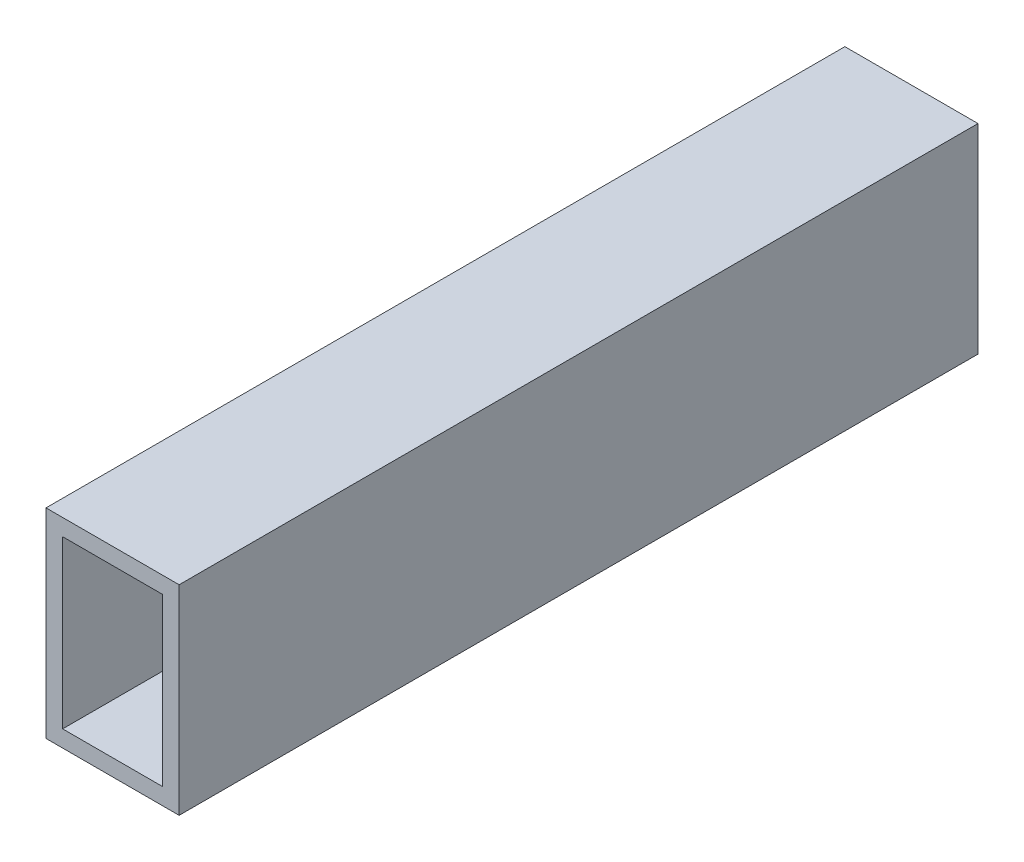
ISO-10303-21;
HEADER;
FILE_DESCRIPTION(('STEP AP214'),'2;1');
FILE_NAME('part.step','',(''),(''),'','','');
FILE_SCHEMA(('AUTOMOTIVE_DESIGN { 1 0 10303 214 1 1 1 1 }'));
ENDSEC;
DATA;
#1=APPLICATION_CONTEXT('core data for automotive mechanical design processes');
#2=APPLICATION_PROTOCOL_DEFINITION('international standard','automotive_design',2000,#1);
#3=PRODUCT_CONTEXT('',#1,'mechanical');
#4=PRODUCT('Part','Part','',(#3));
#5=PRODUCT_RELATED_PRODUCT_CATEGORY('part','',(#4));
#6=PRODUCT_DEFINITION_FORMATION('','',#4);
#7=PRODUCT_DEFINITION_CONTEXT('part definition',#1,'design');
#8=PRODUCT_DEFINITION('design','',#6,#7);
#9=PRODUCT_DEFINITION_SHAPE('','',#8);
#10=(LENGTH_UNIT() NAMED_UNIT(*) SI_UNIT(.MILLI.,.METRE.));
#11=(NAMED_UNIT(*) PLANE_ANGLE_UNIT() SI_UNIT($,.RADIAN.));
#12=(NAMED_UNIT(*) SI_UNIT($,.STERADIAN.) SOLID_ANGLE_UNIT());
#13=UNCERTAINTY_MEASURE_WITH_UNIT(LENGTH_MEASURE(1.E-05),#10,'distance_accuracy_value','');
#14=(GEOMETRIC_REPRESENTATION_CONTEXT(3) GLOBAL_UNCERTAINTY_ASSIGNED_CONTEXT((#13)) GLOBAL_UNIT_ASSIGNED_CONTEXT((#10,
#11,#12)) REPRESENTATION_CONTEXT('',''));
#15=CARTESIAN_POINT('',(0.,0.,0.));
#16=DIRECTION('',(0.,0.,1.));
#17=DIRECTION('',(1.,0.,0.));
#18=AXIS2_PLACEMENT_3D('',#15,#16,#17);
#19=CARTESIAN_POINT('',(0.,0.,152.4));
#20=DIRECTION('',(0.,0.,1.));
#21=DIRECTION('',(1.,0.,0.));
#22=AXIS2_PLACEMENT_3D('',#19,#20,#21);
#23=PLANE('',#22);
#24=DIRECTION('',(0.,1.,0.));
#25=VECTOR('',#24,1.);
#26=CARTESIAN_POINT('',(12.7,19.05,152.4));
#27=LINE('',#26,#25);
#28=CARTESIAN_POINT('',(12.7,-19.05,152.4));
#29=VERTEX_POINT('',#28);
#30=CARTESIAN_POINT('',(12.7,19.05,152.4));
#31=VERTEX_POINT('',#30);
#32=EDGE_CURVE('E136',#29,#31,#27,.T.);
#33=ORIENTED_EDGE('',*,*,#32,.T.);
#34=DIRECTION('',(-1.,0.,0.));
#35=VECTOR('',#34,1.);
#36=CARTESIAN_POINT('',(-12.7,19.05,152.4));
#37=LINE('',#36,#35);
#38=CARTESIAN_POINT('',(-12.7,19.05,152.4));
#39=VERTEX_POINT('',#38);
#40=EDGE_CURVE('E139',#31,#39,#37,.T.);
#41=ORIENTED_EDGE('',*,*,#40,.T.);
#42=DIRECTION('',(0.,-1.,0.));
#43=VECTOR('',#42,1.);
#44=CARTESIAN_POINT('',(-12.7,19.05,152.4));
#45=LINE('',#44,#43);
#46=CARTESIAN_POINT('',(-12.7,-19.05,152.4));
#47=VERTEX_POINT('',#46);
#48=EDGE_CURVE('E142',#39,#47,#45,.T.);
#49=ORIENTED_EDGE('',*,*,#48,.T.);
#50=DIRECTION('',(1.,0.,0.));
#51=VECTOR('',#50,1.);
#52=CARTESIAN_POINT('',(-12.7,-19.05,152.4));
#53=LINE('',#52,#51);
#54=EDGE_CURVE('E144',#47,#29,#53,.T.);
#55=ORIENTED_EDGE('',*,*,#54,.T.);
#56=EDGE_LOOP('',(#33,#41,#49,#55));
#57=FACE_BOUND('',#56,.T.);
#58=DIRECTION('',(-1.,0.,0.));
#59=VECTOR('',#58,1.);
#60=CARTESIAN_POINT('',(-9.525,15.875,152.4));
#61=LINE('',#60,#59);
#62=CARTESIAN_POINT('',(9.525,15.875,152.4));
#63=VERTEX_POINT('',#62);
#64=CARTESIAN_POINT('',(-9.525,15.875,152.4));
#65=VERTEX_POINT('',#64);
#66=EDGE_CURVE('E108',#63,#65,#61,.T.);
#67=ORIENTED_EDGE('',*,*,#66,.F.);
#68=DIRECTION('',(0.,1.,0.));
#69=VECTOR('',#68,1.);
#70=CARTESIAN_POINT('',(9.525,15.875,152.4));
#71=LINE('',#70,#69);
#72=CARTESIAN_POINT('',(9.525,-15.875,152.4));
#73=VERTEX_POINT('',#72);
#74=EDGE_CURVE('E100',#73,#63,#71,.T.);
#75=ORIENTED_EDGE('',*,*,#74,.F.);
#76=DIRECTION('',(1.,0.,0.));
#77=VECTOR('',#76,1.);
#78=CARTESIAN_POINT('',(-9.525,-15.875,152.4));
#79=LINE('',#78,#77);
#80=CARTESIAN_POINT('',(-9.525,-15.875,152.4));
#81=VERTEX_POINT('',#80);
#82=EDGE_CURVE('E122',#81,#73,#79,.T.);
#83=ORIENTED_EDGE('',*,*,#82,.F.);
#84=DIRECTION('',(0.,-1.,0.));
#85=VECTOR('',#84,1.);
#86=CARTESIAN_POINT('',(-9.525,15.875,152.4));
#87=LINE('',#86,#85);
#88=EDGE_CURVE('E120',#65,#81,#87,.T.);
#89=ORIENTED_EDGE('',*,*,#88,.F.);
#90=EDGE_LOOP('',(#67,#75,#83,#89));
#91=FACE_BOUND('',#90,.T.);
#92=ADVANCED_FACE('F35',(#57,#91),#23,.T.);
#93=CARTESIAN_POINT('',(0.,0.,0.));
#94=DIRECTION('',(0.,0.,1.));
#95=DIRECTION('',(1.,0.,0.));
#96=AXIS2_PLACEMENT_3D('',#93,#94,#95);
#97=PLANE('',#96);
#98=DIRECTION('',(0.,1.,0.));
#99=VECTOR('',#98,1.);
#100=CARTESIAN_POINT('',(12.7,19.05,0.));
#101=LINE('',#100,#99);
#102=CARTESIAN_POINT('',(12.7,-19.05,0.));
#103=VERTEX_POINT('',#102);
#104=CARTESIAN_POINT('',(12.7,19.05,0.));
#105=VERTEX_POINT('',#104);
#106=EDGE_CURVE('E116',#103,#105,#101,.T.);
#107=ORIENTED_EDGE('',*,*,#106,.F.);
#108=DIRECTION('',(1.,0.,0.));
#109=VECTOR('',#108,1.);
#110=CARTESIAN_POINT('',(-12.7,-19.05,0.));
#111=LINE('',#110,#109);
#112=CARTESIAN_POINT('',(-12.7,-19.05,0.));
#113=VERTEX_POINT('',#112);
#114=EDGE_CURVE('E140',#113,#103,#111,.T.);
#115=ORIENTED_EDGE('',*,*,#114,.F.);
#116=DIRECTION('',(0.,-1.,0.));
#117=VECTOR('',#116,1.);
#118=CARTESIAN_POINT('',(-12.7,19.05,0.));
#119=LINE('',#118,#117);
#120=CARTESIAN_POINT('',(-12.7,19.05,0.));
#121=VERTEX_POINT('',#120);
#122=EDGE_CURVE('E151',#121,#113,#119,.T.);
#123=ORIENTED_EDGE('',*,*,#122,.F.);
#124=DIRECTION('',(-1.,0.,0.));
#125=VECTOR('',#124,1.);
#126=CARTESIAN_POINT('',(-12.7,19.05,0.));
#127=LINE('',#126,#125);
#128=EDGE_CURVE('E149',#105,#121,#127,.T.);
#129=ORIENTED_EDGE('',*,*,#128,.F.);
#130=EDGE_LOOP('',(#107,#115,#123,#129));
#131=FACE_BOUND('',#130,.T.);
#132=DIRECTION('',(0.,1.,0.));
#133=VECTOR('',#132,1.);
#134=CARTESIAN_POINT('',(9.525,15.875,0.));
#135=LINE('',#134,#133);
#136=CARTESIAN_POINT('',(9.525,-15.875,0.));
#137=VERTEX_POINT('',#136);
#138=CARTESIAN_POINT('',(9.525,15.875,0.));
#139=VERTEX_POINT('',#138);
#140=EDGE_CURVE('E58',#137,#139,#135,.T.);
#141=ORIENTED_EDGE('',*,*,#140,.T.);
#142=DIRECTION('',(-1.,0.,0.));
#143=VECTOR('',#142,1.);
#144=CARTESIAN_POINT('',(-9.525,15.875,0.));
#145=LINE('',#144,#143);
#146=CARTESIAN_POINT('',(-9.525,15.875,0.));
#147=VERTEX_POINT('',#146);
#148=EDGE_CURVE('E115',#139,#147,#145,.T.);
#149=ORIENTED_EDGE('',*,*,#148,.T.);
#150=DIRECTION('',(0.,-1.,0.));
#151=VECTOR('',#150,1.);
#152=CARTESIAN_POINT('',(-9.525,15.875,0.));
#153=LINE('',#152,#151);
#154=CARTESIAN_POINT('',(-9.525,-15.875,0.));
#155=VERTEX_POINT('',#154);
#156=EDGE_CURVE('E128',#147,#155,#153,.T.);
#157=ORIENTED_EDGE('',*,*,#156,.T.);
#158=DIRECTION('',(1.,0.,0.));
#159=VECTOR('',#158,1.);
#160=CARTESIAN_POINT('',(-9.525,-15.875,0.));
#161=LINE('',#160,#159);
#162=EDGE_CURVE('E109',#155,#137,#161,.T.);
#163=ORIENTED_EDGE('',*,*,#162,.T.);
#164=EDGE_LOOP('',(#141,#149,#157,#163));
#165=FACE_BOUND('',#164,.T.);
#166=ADVANCED_FACE('F169',(#131,#165),#97,.F.);
#167=CARTESIAN_POINT('',(12.7,19.05,152.4));
#168=DIRECTION('',(-1.,0.,0.));
#169=DIRECTION('',(0.,-1.,0.));
#170=AXIS2_PLACEMENT_3D('',#167,#168,#169);
#171=PLANE('',#170);
#172=ORIENTED_EDGE('',*,*,#106,.T.);
#173=DIRECTION('',(0.,0.,-1.));
#174=VECTOR('',#173,1.);
#175=CARTESIAN_POINT('',(12.7,19.05,152.4));
#176=LINE('',#175,#174);
#177=EDGE_CURVE('E11',#31,#105,#176,.T.);
#178=ORIENTED_EDGE('',*,*,#177,.F.);
#179=ORIENTED_EDGE('',*,*,#32,.F.);
#180=DIRECTION('',(0.,0.,-1.));
#181=VECTOR('',#180,1.);
#182=CARTESIAN_POINT('',(12.7,-19.05,152.4));
#183=LINE('',#182,#181);
#184=EDGE_CURVE('E146',#29,#103,#183,.T.);
#185=ORIENTED_EDGE('',*,*,#184,.T.);
#186=EDGE_LOOP('',(#172,#178,#179,#185));
#187=FACE_BOUND('',#186,.T.);
#188=ADVANCED_FACE('F37',(#187),#171,.F.);
#189=CARTESIAN_POINT('',(-12.7,19.05,152.4));
#190=DIRECTION('',(0.,-1.,0.));
#191=DIRECTION('',(0.,0.,-1.));
#192=AXIS2_PLACEMENT_3D('',#189,#190,#191);
#193=PLANE('',#192);
#194=ORIENTED_EDGE('',*,*,#128,.T.);
#195=DIRECTION('',(0.,0.,-1.));
#196=VECTOR('',#195,1.);
#197=CARTESIAN_POINT('',(-12.7,19.05,152.4));
#198=LINE('',#197,#196);
#199=EDGE_CURVE('E43',#39,#121,#198,.T.);
#200=ORIENTED_EDGE('',*,*,#199,.F.);
#201=ORIENTED_EDGE('',*,*,#40,.F.);
#202=ORIENTED_EDGE('',*,*,#177,.T.);
#203=EDGE_LOOP('',(#194,#200,#201,#202));
#204=FACE_BOUND('',#203,.T.);
#205=ADVANCED_FACE('F179',(#204),#193,.F.);
#206=CARTESIAN_POINT('',(-12.7,19.05,152.4));
#207=DIRECTION('',(1.,0.,0.));
#208=DIRECTION('',(0.,1.,0.));
#209=AXIS2_PLACEMENT_3D('',#206,#207,#208);
#210=PLANE('',#209);
#211=ORIENTED_EDGE('',*,*,#122,.T.);
#212=DIRECTION('',(0.,0.,-1.));
#213=VECTOR('',#212,1.);
#214=CARTESIAN_POINT('',(-12.7,-19.05,152.4));
#215=LINE('',#214,#213);
#216=EDGE_CURVE('E156',#47,#113,#215,.T.);
#217=ORIENTED_EDGE('',*,*,#216,.F.);
#218=ORIENTED_EDGE('',*,*,#48,.F.);
#219=ORIENTED_EDGE('',*,*,#199,.T.);
#220=EDGE_LOOP('',(#211,#217,#218,#219));
#221=FACE_BOUND('',#220,.T.);
#222=ADVANCED_FACE('F163',(#221),#210,.F.);
#223=CARTESIAN_POINT('',(-12.7,-19.05,152.4));
#224=DIRECTION('',(0.,1.,0.));
#225=DIRECTION('',(0.,0.,1.));
#226=AXIS2_PLACEMENT_3D('',#223,#224,#225);
#227=PLANE('',#226);
#228=ORIENTED_EDGE('',*,*,#114,.T.);
#229=ORIENTED_EDGE('',*,*,#184,.F.);
#230=ORIENTED_EDGE('',*,*,#54,.F.);
#231=ORIENTED_EDGE('',*,*,#216,.T.);
#232=EDGE_LOOP('',(#228,#229,#230,#231));
#233=FACE_BOUND('',#232,.T.);
#234=ADVANCED_FACE('F173',(#233),#227,.F.);
#235=CARTESIAN_POINT('',(9.525,15.875,152.4));
#236=DIRECTION('',(-1.,0.,0.));
#237=DIRECTION('',(0.,-1.,0.));
#238=AXIS2_PLACEMENT_3D('',#235,#236,#237);
#239=PLANE('',#238);
#240=ORIENTED_EDGE('',*,*,#140,.F.);
#241=DIRECTION('',(0.,0.,-1.));
#242=VECTOR('',#241,1.);
#243=CARTESIAN_POINT('',(9.525,-15.875,152.4));
#244=LINE('',#243,#242);
#245=EDGE_CURVE('E104',#73,#137,#244,.T.);
#246=ORIENTED_EDGE('',*,*,#245,.F.);
#247=ORIENTED_EDGE('',*,*,#74,.T.);
#248=DIRECTION('',(0.,0.,-1.));
#249=VECTOR('',#248,1.);
#250=CARTESIAN_POINT('',(9.525,15.875,152.4));
#251=LINE('',#250,#249);
#252=EDGE_CURVE('E103',#63,#139,#251,.T.);
#253=ORIENTED_EDGE('',*,*,#252,.T.);
#254=EDGE_LOOP('',(#240,#246,#247,#253));
#255=FACE_BOUND('',#254,.T.);
#256=ADVANCED_FACE('F102',(#255),#239,.T.);
#257=CARTESIAN_POINT('',(-9.525,15.875,152.4));
#258=DIRECTION('',(0.,-1.,0.));
#259=DIRECTION('',(0.,0.,-1.));
#260=AXIS2_PLACEMENT_3D('',#257,#258,#259);
#261=PLANE('',#260);
#262=ORIENTED_EDGE('',*,*,#148,.F.);
#263=ORIENTED_EDGE('',*,*,#252,.F.);
#264=ORIENTED_EDGE('',*,*,#66,.T.);
#265=DIRECTION('',(0.,0.,-1.));
#266=VECTOR('',#265,1.);
#267=CARTESIAN_POINT('',(-9.525,15.875,152.4));
#268=LINE('',#267,#266);
#269=EDGE_CURVE('E117',#65,#147,#268,.T.);
#270=ORIENTED_EDGE('',*,*,#269,.T.);
#271=EDGE_LOOP('',(#262,#263,#264,#270));
#272=FACE_BOUND('',#271,.T.);
#273=ADVANCED_FACE('F112',(#272),#261,.T.);
#274=CARTESIAN_POINT('',(-9.525,15.875,152.4));
#275=DIRECTION('',(1.,0.,0.));
#276=DIRECTION('',(0.,1.,0.));
#277=AXIS2_PLACEMENT_3D('',#274,#275,#276);
#278=PLANE('',#277);
#279=ORIENTED_EDGE('',*,*,#156,.F.);
#280=ORIENTED_EDGE('',*,*,#269,.F.);
#281=ORIENTED_EDGE('',*,*,#88,.T.);
#282=DIRECTION('',(0.,0.,-1.));
#283=VECTOR('',#282,1.);
#284=CARTESIAN_POINT('',(-9.525,-15.875,152.4));
#285=LINE('',#284,#283);
#286=EDGE_CURVE('E50',#81,#155,#285,.T.);
#287=ORIENTED_EDGE('',*,*,#286,.T.);
#288=EDGE_LOOP('',(#279,#280,#281,#287));
#289=FACE_BOUND('',#288,.T.);
#290=ADVANCED_FACE('F202',(#289),#278,.T.);
#291=CARTESIAN_POINT('',(-9.525,-15.875,152.4));
#292=DIRECTION('',(0.,1.,0.));
#293=DIRECTION('',(0.,0.,1.));
#294=AXIS2_PLACEMENT_3D('',#291,#292,#293);
#295=PLANE('',#294);
#296=ORIENTED_EDGE('',*,*,#162,.F.);
#297=ORIENTED_EDGE('',*,*,#286,.F.);
#298=ORIENTED_EDGE('',*,*,#82,.T.);
#299=ORIENTED_EDGE('',*,*,#245,.T.);
#300=EDGE_LOOP('',(#296,#297,#298,#299));
#301=FACE_BOUND('',#300,.T.);
#302=ADVANCED_FACE('F206',(#301),#295,.T.);
#303=CLOSED_SHELL('',(#92,#166,#188,#205,#222,#234,#256,#273,#290,#302));
#304=MANIFOLD_SOLID_BREP('B2',#303);
#305=ADVANCED_BREP_SHAPE_REPRESENTATION('',(#18,#304),#14);
#306=SHAPE_DEFINITION_REPRESENTATION(#9,#305);
ENDSEC;
END-ISO-10303-21;
